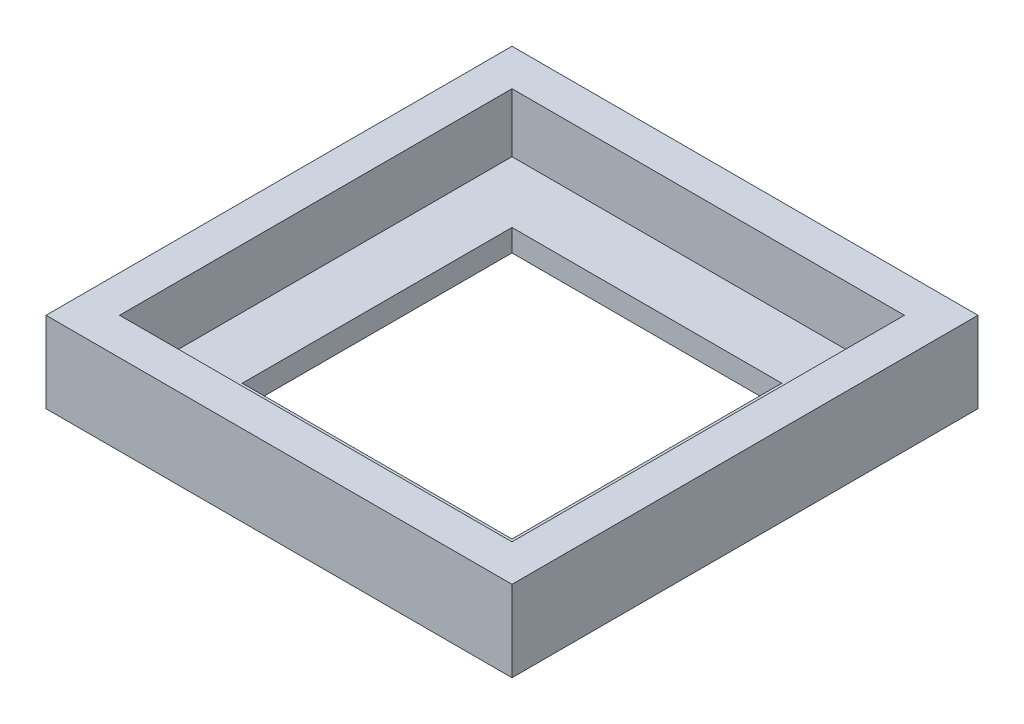
ISO-10303-21;
HEADER;
FILE_DESCRIPTION(('STEP AP214'),'2;1');
FILE_NAME('part.step','',(''),(''),'','','');
FILE_SCHEMA(('AUTOMOTIVE_DESIGN { 1 0 10303 214 1 1 1 1 }'));
ENDSEC;
DATA;
#1=APPLICATION_CONTEXT('core data for automotive mechanical design processes');
#2=APPLICATION_PROTOCOL_DEFINITION('international standard','automotive_design',2000,#1);
#3=PRODUCT_CONTEXT('',#1,'mechanical');
#4=PRODUCT('Part','Part','',(#3));
#5=PRODUCT_RELATED_PRODUCT_CATEGORY('part','',(#4));
#6=PRODUCT_DEFINITION_FORMATION('','',#4);
#7=PRODUCT_DEFINITION_CONTEXT('part definition',#1,'design');
#8=PRODUCT_DEFINITION('design','',#6,#7);
#9=PRODUCT_DEFINITION_SHAPE('','',#8);
#10=(LENGTH_UNIT() NAMED_UNIT(*) SI_UNIT(.MILLI.,.METRE.));
#11=(NAMED_UNIT(*) PLANE_ANGLE_UNIT() SI_UNIT($,.RADIAN.));
#12=(NAMED_UNIT(*) SI_UNIT($,.STERADIAN.) SOLID_ANGLE_UNIT());
#13=UNCERTAINTY_MEASURE_WITH_UNIT(LENGTH_MEASURE(1.E-05),#10,'distance_accuracy_value','');
#14=(GEOMETRIC_REPRESENTATION_CONTEXT(3) GLOBAL_UNCERTAINTY_ASSIGNED_CONTEXT((#13)) GLOBAL_UNIT_ASSIGNED_CONTEXT((#10,
#11,#12)) REPRESENTATION_CONTEXT('',''));
#15=CARTESIAN_POINT('',(0.,0.,0.));
#16=DIRECTION('',(0.,0.,1.));
#17=DIRECTION('',(1.,0.,0.));
#18=AXIS2_PLACEMENT_3D('',#15,#16,#17);
#19=CARTESIAN_POINT('',(0.,1.8,0.));
#20=DIRECTION('',(0.,1.,0.));
#21=DIRECTION('',(0.,0.,1.));
#22=AXIS2_PLACEMENT_3D('',#19,#20,#21);
#23=PLANE('',#22);
#24=DIRECTION('',(-1.,0.,0.));
#25=VECTOR('',#24,1.);
#26=CARTESIAN_POINT('',(35.,1.8,-35.));
#27=LINE('',#26,#25);
#28=CARTESIAN_POINT('',(35.,1.8,-35.));
#29=VERTEX_POINT('',#28);
#30=CARTESIAN_POINT('',(3.,1.8,-35.));
#31=VERTEX_POINT('',#30);
#32=EDGE_CURVE('E48',#29,#31,#27,.T.);
#33=ORIENTED_EDGE('',*,*,#32,.T.);
#34=DIRECTION('',(0.,0.,1.));
#35=VECTOR('',#34,1.);
#36=CARTESIAN_POINT('',(3.,1.8,-35.));
#37=LINE('',#36,#35);
#38=CARTESIAN_POINT('',(3.,1.8,-3.));
#39=VERTEX_POINT('',#38);
#40=EDGE_CURVE('E52',#31,#39,#37,.T.);
#41=ORIENTED_EDGE('',*,*,#40,.T.);
#42=DIRECTION('',(1.,0.,0.));
#43=VECTOR('',#42,1.);
#44=CARTESIAN_POINT('',(3.,1.8,-3.));
#45=LINE('',#44,#43);
#46=CARTESIAN_POINT('',(35.,1.8,-3.));
#47=VERTEX_POINT('',#46);
#48=EDGE_CURVE('E150',#39,#47,#45,.T.);
#49=ORIENTED_EDGE('',*,*,#48,.T.);
#50=DIRECTION('',(0.,0.,-1.));
#51=VECTOR('',#50,1.);
#52=CARTESIAN_POINT('',(35.,1.8,-3.));
#53=LINE('',#52,#51);
#54=EDGE_CURVE('E131',#47,#29,#53,.T.);
#55=ORIENTED_EDGE('',*,*,#54,.T.);
#56=EDGE_LOOP('',(#33,#41,#49,#55));
#57=FACE_BOUND('',#56,.T.);
#58=DIRECTION('',(1.,0.,0.));
#59=VECTOR('',#58,1.);
#60=CARTESIAN_POINT('',(8.,1.8,-8.));
#61=LINE('',#60,#59);
#62=CARTESIAN_POINT('',(8.,1.8,-8.));
#63=VERTEX_POINT('',#62);
#64=CARTESIAN_POINT('',(30.,1.8,-8.));
#65=VERTEX_POINT('',#64);
#66=EDGE_CURVE('E172',#63,#65,#61,.T.);
#67=ORIENTED_EDGE('',*,*,#66,.F.);
#68=DIRECTION('',(0.,0.,1.));
#69=VECTOR('',#68,1.);
#70=CARTESIAN_POINT('',(8.,1.8,-30.));
#71=LINE('',#70,#69);
#72=CARTESIAN_POINT('',(8.,1.8,-30.));
#73=VERTEX_POINT('',#72);
#74=EDGE_CURVE('E170',#73,#63,#71,.T.);
#75=ORIENTED_EDGE('',*,*,#74,.F.);
#76=DIRECTION('',(-1.,0.,0.));
#77=VECTOR('',#76,1.);
#78=CARTESIAN_POINT('',(30.,1.8,-30.));
#79=LINE('',#78,#77);
#80=CARTESIAN_POINT('',(30.,1.8,-30.));
#81=VERTEX_POINT('',#80);
#82=EDGE_CURVE('E178',#81,#73,#79,.T.);
#83=ORIENTED_EDGE('',*,*,#82,.F.);
#84=DIRECTION('',(0.,0.,-1.));
#85=VECTOR('',#84,1.);
#86=CARTESIAN_POINT('',(30.,1.8,-8.));
#87=LINE('',#86,#85);
#88=EDGE_CURVE('E175',#65,#81,#87,.T.);
#89=ORIENTED_EDGE('',*,*,#88,.F.);
#90=EDGE_LOOP('',(#67,#75,#83,#89));
#91=FACE_BOUND('',#90,.T.);
#92=ADVANCED_FACE('F33',(#57,#91),#23,.T.);
#93=CARTESIAN_POINT('',(0.,0.,0.));
#94=DIRECTION('',(0.,1.,0.));
#95=DIRECTION('',(0.,0.,1.));
#96=AXIS2_PLACEMENT_3D('',#93,#94,#95);
#97=PLANE('',#96);
#98=DIRECTION('',(0.,0.,1.));
#99=VECTOR('',#98,1.);
#100=CARTESIAN_POINT('',(0.,0.,-38.));
#101=LINE('',#100,#99);
#102=CARTESIAN_POINT('',(0.,0.,-38.));
#103=VERTEX_POINT('',#102);
#104=CARTESIAN_POINT('',(0.,0.,0.));
#105=VERTEX_POINT('',#104);
#106=EDGE_CURVE('E200',#103,#105,#101,.T.);
#107=ORIENTED_EDGE('',*,*,#106,.F.);
#108=DIRECTION('',(-1.,0.,0.));
#109=VECTOR('',#108,1.);
#110=CARTESIAN_POINT('',(38.,0.,-38.));
#111=LINE('',#110,#109);
#112=CARTESIAN_POINT('',(38.,0.,-38.));
#113=VERTEX_POINT('',#112);
#114=EDGE_CURVE('E207',#113,#103,#111,.T.);
#115=ORIENTED_EDGE('',*,*,#114,.F.);
#116=DIRECTION('',(0.,0.,-1.));
#117=VECTOR('',#116,1.);
#118=CARTESIAN_POINT('',(38.,0.,0.));
#119=LINE('',#118,#117);
#120=CARTESIAN_POINT('',(38.,0.,0.));
#121=VERTEX_POINT('',#120);
#122=EDGE_CURVE('E205',#121,#113,#119,.T.);
#123=ORIENTED_EDGE('',*,*,#122,.F.);
#124=DIRECTION('',(1.,0.,0.));
#125=VECTOR('',#124,1.);
#126=CARTESIAN_POINT('',(0.,0.,0.));
#127=LINE('',#126,#125);
#128=EDGE_CURVE('E203',#105,#121,#127,.T.);
#129=ORIENTED_EDGE('',*,*,#128,.F.);
#130=EDGE_LOOP('',(#107,#115,#123,#129));
#131=FACE_BOUND('',#130,.T.);
#132=DIRECTION('',(0.,0.,1.));
#133=VECTOR('',#132,1.);
#134=CARTESIAN_POINT('',(8.,0.,-30.));
#135=LINE('',#134,#133);
#136=CARTESIAN_POINT('',(8.,0.,-30.));
#137=VERTEX_POINT('',#136);
#138=CARTESIAN_POINT('',(8.,0.,-8.));
#139=VERTEX_POINT('',#138);
#140=EDGE_CURVE('E169',#137,#139,#135,.T.);
#141=ORIENTED_EDGE('',*,*,#140,.T.);
#142=DIRECTION('',(1.,0.,0.));
#143=VECTOR('',#142,1.);
#144=CARTESIAN_POINT('',(8.,0.,-8.));
#145=LINE('',#144,#143);
#146=CARTESIAN_POINT('',(30.,0.,-8.));
#147=VERTEX_POINT('',#146);
#148=EDGE_CURVE('E183',#139,#147,#145,.T.);
#149=ORIENTED_EDGE('',*,*,#148,.T.);
#150=DIRECTION('',(0.,0.,-1.));
#151=VECTOR('',#150,1.);
#152=CARTESIAN_POINT('',(30.,0.,-8.));
#153=LINE('',#152,#151);
#154=CARTESIAN_POINT('',(30.,0.,-30.));
#155=VERTEX_POINT('',#154);
#156=EDGE_CURVE('E186',#147,#155,#153,.T.);
#157=ORIENTED_EDGE('',*,*,#156,.T.);
#158=DIRECTION('',(-1.,0.,0.));
#159=VECTOR('',#158,1.);
#160=CARTESIAN_POINT('',(30.,0.,-30.));
#161=LINE('',#160,#159);
#162=EDGE_CURVE('E173',#155,#137,#161,.T.);
#163=ORIENTED_EDGE('',*,*,#162,.T.);
#164=EDGE_LOOP('',(#141,#149,#157,#163));
#165=FACE_BOUND('',#164,.T.);
#166=ADVANCED_FACE('F224',(#131,#165),#97,.F.);
#167=CARTESIAN_POINT('',(0.,1.8,-38.));
#168=DIRECTION('',(1.,0.,0.));
#169=DIRECTION('',(0.,0.,-1.));
#170=AXIS2_PLACEMENT_3D('',#167,#168,#169);
#171=PLANE('',#170);
#172=ORIENTED_EDGE('',*,*,#106,.T.);
#173=DIRECTION('',(0.,-1.,0.));
#174=VECTOR('',#173,1.);
#175=CARTESIAN_POINT('',(0.,1.8,0.));
#176=LINE('',#175,#174);
#177=CARTESIAN_POINT('',(0.,6.6,0.));
#178=VERTEX_POINT('',#177);
#179=EDGE_CURVE('E11',#178,#105,#176,.T.);
#180=ORIENTED_EDGE('',*,*,#179,.F.);
#181=DIRECTION('',(0.,0.,1.));
#182=VECTOR('',#181,1.);
#183=CARTESIAN_POINT('',(0.,6.6,-38.));
#184=LINE('',#183,#182);
#185=CARTESIAN_POINT('',(0.,6.6,-38.));
#186=VERTEX_POINT('',#185);
#187=EDGE_CURVE('E160',#186,#178,#184,.T.);
#188=ORIENTED_EDGE('',*,*,#187,.F.);
#189=DIRECTION('',(0.,-1.,0.));
#190=VECTOR('',#189,1.);
#191=CARTESIAN_POINT('',(0.,1.8,-38.));
#192=LINE('',#191,#190);
#193=EDGE_CURVE('E209',#186,#103,#192,.T.);
#194=ORIENTED_EDGE('',*,*,#193,.T.);
#195=EDGE_LOOP('',(#172,#180,#188,#194));
#196=FACE_BOUND('',#195,.T.);
#197=ADVANCED_FACE('F35',(#196),#171,.F.);
#198=CARTESIAN_POINT('',(0.,1.8,0.));
#199=DIRECTION('',(0.,0.,-1.));
#200=DIRECTION('',(-1.,0.,0.));
#201=AXIS2_PLACEMENT_3D('',#198,#199,#200);
#202=PLANE('',#201);
#203=ORIENTED_EDGE('',*,*,#128,.T.);
#204=DIRECTION('',(0.,-1.,0.));
#205=VECTOR('',#204,1.);
#206=CARTESIAN_POINT('',(38.,1.8,0.));
#207=LINE('',#206,#205);
#208=CARTESIAN_POINT('',(38.,6.6,0.));
#209=VERTEX_POINT('',#208);
#210=EDGE_CURVE('E41',#209,#121,#207,.T.);
#211=ORIENTED_EDGE('',*,*,#210,.F.);
#212=DIRECTION('',(1.,0.,0.));
#213=VECTOR('',#212,1.);
#214=CARTESIAN_POINT('',(0.,6.6,0.));
#215=LINE('',#214,#213);
#216=EDGE_CURVE('E163',#178,#209,#215,.T.);
#217=ORIENTED_EDGE('',*,*,#216,.F.);
#218=ORIENTED_EDGE('',*,*,#179,.T.);
#219=EDGE_LOOP('',(#203,#211,#217,#218));
#220=FACE_BOUND('',#219,.T.);
#221=ADVANCED_FACE('F232',(#220),#202,.F.);
#222=CARTESIAN_POINT('',(38.,1.8,0.));
#223=DIRECTION('',(-1.,0.,0.));
#224=DIRECTION('',(0.,0.,1.));
#225=AXIS2_PLACEMENT_3D('',#222,#223,#224);
#226=PLANE('',#225);
#227=ORIENTED_EDGE('',*,*,#122,.T.);
#228=DIRECTION('',(0.,-1.,0.));
#229=VECTOR('',#228,1.);
#230=CARTESIAN_POINT('',(38.,1.8,-38.));
#231=LINE('',#230,#229);
#232=CARTESIAN_POINT('',(38.,6.6,-38.));
#233=VERTEX_POINT('',#232);
#234=EDGE_CURVE('E212',#233,#113,#231,.T.);
#235=ORIENTED_EDGE('',*,*,#234,.F.);
#236=DIRECTION('',(0.,0.,-1.));
#237=VECTOR('',#236,1.);
#238=CARTESIAN_POINT('',(38.,6.6,0.));
#239=LINE('',#238,#237);
#240=EDGE_CURVE('E166',#209,#233,#239,.T.);
#241=ORIENTED_EDGE('',*,*,#240,.F.);
#242=ORIENTED_EDGE('',*,*,#210,.T.);
#243=EDGE_LOOP('',(#227,#235,#241,#242));
#244=FACE_BOUND('',#243,.T.);
#245=ADVANCED_FACE('F218',(#244),#226,.F.);
#246=CARTESIAN_POINT('',(38.,1.8,-38.));
#247=DIRECTION('',(0.,0.,1.));
#248=DIRECTION('',(1.,0.,0.));
#249=AXIS2_PLACEMENT_3D('',#246,#247,#248);
#250=PLANE('',#249);
#251=ORIENTED_EDGE('',*,*,#114,.T.);
#252=ORIENTED_EDGE('',*,*,#193,.F.);
#253=DIRECTION('',(-1.,0.,0.));
#254=VECTOR('',#253,1.);
#255=CARTESIAN_POINT('',(38.,6.6,-38.));
#256=LINE('',#255,#254);
#257=EDGE_CURVE('E136',#233,#186,#256,.T.);
#258=ORIENTED_EDGE('',*,*,#257,.F.);
#259=ORIENTED_EDGE('',*,*,#234,.T.);
#260=EDGE_LOOP('',(#251,#252,#258,#259));
#261=FACE_BOUND('',#260,.T.);
#262=ADVANCED_FACE('F227',(#261),#250,.F.);
#263=CARTESIAN_POINT('',(8.,1.8,-30.));
#264=DIRECTION('',(1.,0.,0.));
#265=DIRECTION('',(0.,0.,-1.));
#266=AXIS2_PLACEMENT_3D('',#263,#264,#265);
#267=PLANE('',#266);
#268=ORIENTED_EDGE('',*,*,#140,.F.);
#269=DIRECTION('',(0.,-1.,0.));
#270=VECTOR('',#269,1.);
#271=CARTESIAN_POINT('',(8.,1.8,-30.));
#272=LINE('',#271,#270);
#273=EDGE_CURVE('E180',#73,#137,#272,.T.);
#274=ORIENTED_EDGE('',*,*,#273,.F.);
#275=ORIENTED_EDGE('',*,*,#74,.T.);
#276=DIRECTION('',(0.,-1.,0.));
#277=VECTOR('',#276,1.);
#278=CARTESIAN_POINT('',(8.,1.8,-8.));
#279=LINE('',#278,#277);
#280=EDGE_CURVE('E197',#63,#139,#279,.T.);
#281=ORIENTED_EDGE('',*,*,#280,.T.);
#282=EDGE_LOOP('',(#268,#274,#275,#281));
#283=FACE_BOUND('',#282,.T.);
#284=ADVANCED_FACE('F247',(#283),#267,.T.);
#285=CARTESIAN_POINT('',(8.,1.8,-8.));
#286=DIRECTION('',(0.,0.,-1.));
#287=DIRECTION('',(-1.,0.,0.));
#288=AXIS2_PLACEMENT_3D('',#285,#286,#287);
#289=PLANE('',#288);
#290=ORIENTED_EDGE('',*,*,#148,.F.);
#291=ORIENTED_EDGE('',*,*,#280,.F.);
#292=ORIENTED_EDGE('',*,*,#66,.T.);
#293=DIRECTION('',(0.,-1.,0.));
#294=VECTOR('',#293,1.);
#295=CARTESIAN_POINT('',(30.,1.8,-8.));
#296=LINE('',#295,#294);
#297=EDGE_CURVE('E195',#65,#147,#296,.T.);
#298=ORIENTED_EDGE('',*,*,#297,.T.);
#299=EDGE_LOOP('',(#290,#291,#292,#298));
#300=FACE_BOUND('',#299,.T.);
#301=ADVANCED_FACE('F254',(#300),#289,.T.);
#302=CARTESIAN_POINT('',(30.,1.8,-8.));
#303=DIRECTION('',(-1.,0.,0.));
#304=DIRECTION('',(0.,0.,1.));
#305=AXIS2_PLACEMENT_3D('',#302,#303,#304);
#306=PLANE('',#305);
#307=ORIENTED_EDGE('',*,*,#156,.F.);
#308=ORIENTED_EDGE('',*,*,#297,.F.);
#309=ORIENTED_EDGE('',*,*,#88,.T.);
#310=DIRECTION('',(0.,-1.,0.));
#311=VECTOR('',#310,1.);
#312=CARTESIAN_POINT('',(30.,1.8,-30.));
#313=LINE('',#312,#311);
#314=EDGE_CURVE('E193',#81,#155,#313,.T.);
#315=ORIENTED_EDGE('',*,*,#314,.T.);
#316=EDGE_LOOP('',(#307,#308,#309,#315));
#317=FACE_BOUND('',#316,.T.);
#318=ADVANCED_FACE('F259',(#317),#306,.T.);
#319=CARTESIAN_POINT('',(30.,1.8,-30.));
#320=DIRECTION('',(0.,0.,1.));
#321=DIRECTION('',(1.,0.,0.));
#322=AXIS2_PLACEMENT_3D('',#319,#320,#321);
#323=PLANE('',#322);
#324=ORIENTED_EDGE('',*,*,#162,.F.);
#325=ORIENTED_EDGE('',*,*,#314,.F.);
#326=ORIENTED_EDGE('',*,*,#82,.T.);
#327=ORIENTED_EDGE('',*,*,#273,.T.);
#328=EDGE_LOOP('',(#324,#325,#326,#327));
#329=FACE_BOUND('',#328,.T.);
#330=ADVANCED_FACE('F266',(#329),#323,.T.);
#331=CARTESIAN_POINT('',(0.,6.6,0.));
#332=DIRECTION('',(0.,1.,0.));
#333=DIRECTION('',(0.,0.,1.));
#334=AXIS2_PLACEMENT_3D('',#331,#332,#333);
#335=PLANE('',#334);
#336=ORIENTED_EDGE('',*,*,#257,.T.);
#337=ORIENTED_EDGE('',*,*,#187,.T.);
#338=ORIENTED_EDGE('',*,*,#216,.T.);
#339=ORIENTED_EDGE('',*,*,#240,.T.);
#340=EDGE_LOOP('',(#336,#337,#338,#339));
#341=FACE_BOUND('',#340,.T.);
#342=DIRECTION('',(0.,0.,1.));
#343=VECTOR('',#342,1.);
#344=CARTESIAN_POINT('',(3.,6.6,-35.));
#345=LINE('',#344,#343);
#346=CARTESIAN_POINT('',(3.,6.6,-35.));
#347=VERTEX_POINT('',#346);
#348=CARTESIAN_POINT('',(3.,6.6,-3.));
#349=VERTEX_POINT('',#348);
#350=EDGE_CURVE('E130',#347,#349,#345,.T.);
#351=ORIENTED_EDGE('',*,*,#350,.F.);
#352=DIRECTION('',(-1.,0.,0.));
#353=VECTOR('',#352,1.);
#354=CARTESIAN_POINT('',(35.,6.6,-35.));
#355=LINE('',#354,#353);
#356=CARTESIAN_POINT('',(35.,6.6,-35.));
#357=VERTEX_POINT('',#356);
#358=EDGE_CURVE('E121',#357,#347,#355,.T.);
#359=ORIENTED_EDGE('',*,*,#358,.F.);
#360=DIRECTION('',(0.,0.,-1.));
#361=VECTOR('',#360,1.);
#362=CARTESIAN_POINT('',(35.,6.6,-3.));
#363=LINE('',#362,#361);
#364=CARTESIAN_POINT('',(35.,6.6,-3.));
#365=VERTEX_POINT('',#364);
#366=EDGE_CURVE('E144',#365,#357,#363,.T.);
#367=ORIENTED_EDGE('',*,*,#366,.F.);
#368=DIRECTION('',(1.,0.,0.));
#369=VECTOR('',#368,1.);
#370=CARTESIAN_POINT('',(3.,6.6,-3.));
#371=LINE('',#370,#369);
#372=EDGE_CURVE('E142',#349,#365,#371,.T.);
#373=ORIENTED_EDGE('',*,*,#372,.F.);
#374=EDGE_LOOP('',(#351,#359,#367,#373));
#375=FACE_BOUND('',#374,.T.);
#376=ADVANCED_FACE('F140',(#341,#375),#335,.T.);
#377=CARTESIAN_POINT('',(35.,6.6,-35.));
#378=DIRECTION('',(0.,0.,1.));
#379=DIRECTION('',(1.,0.,0.));
#380=AXIS2_PLACEMENT_3D('',#377,#378,#379);
#381=PLANE('',#380);
#382=ORIENTED_EDGE('',*,*,#32,.F.);
#383=DIRECTION('',(0.,-1.,0.));
#384=VECTOR('',#383,1.);
#385=CARTESIAN_POINT('',(35.,6.6,-35.));
#386=LINE('',#385,#384);
#387=EDGE_CURVE('E126',#357,#29,#386,.T.);
#388=ORIENTED_EDGE('',*,*,#387,.F.);
#389=ORIENTED_EDGE('',*,*,#358,.T.);
#390=DIRECTION('',(0.,-1.,0.));
#391=VECTOR('',#390,1.);
#392=CARTESIAN_POINT('',(3.,6.6,-35.));
#393=LINE('',#392,#391);
#394=EDGE_CURVE('E124',#347,#31,#393,.T.);
#395=ORIENTED_EDGE('',*,*,#394,.T.);
#396=EDGE_LOOP('',(#382,#388,#389,#395));
#397=FACE_BOUND('',#396,.T.);
#398=ADVANCED_FACE('F123',(#397),#381,.T.);
#399=CARTESIAN_POINT('',(3.,6.6,-35.));
#400=DIRECTION('',(1.,0.,0.));
#401=DIRECTION('',(0.,0.,-1.));
#402=AXIS2_PLACEMENT_3D('',#399,#400,#401);
#403=PLANE('',#402);
#404=ORIENTED_EDGE('',*,*,#40,.F.);
#405=ORIENTED_EDGE('',*,*,#394,.F.);
#406=ORIENTED_EDGE('',*,*,#350,.T.);
#407=DIRECTION('',(0.,-1.,0.));
#408=VECTOR('',#407,1.);
#409=CARTESIAN_POINT('',(3.,6.6,-3.));
#410=LINE('',#409,#408);
#411=EDGE_CURVE('E137',#349,#39,#410,.T.);
#412=ORIENTED_EDGE('',*,*,#411,.T.);
#413=EDGE_LOOP('',(#404,#405,#406,#412));
#414=FACE_BOUND('',#413,.T.);
#415=ADVANCED_FACE('F134',(#414),#403,.T.);
#416=CARTESIAN_POINT('',(3.,6.6,-3.));
#417=DIRECTION('',(0.,0.,-1.));
#418=DIRECTION('',(-1.,0.,0.));
#419=AXIS2_PLACEMENT_3D('',#416,#417,#418);
#420=PLANE('',#419);
#421=ORIENTED_EDGE('',*,*,#48,.F.);
#422=ORIENTED_EDGE('',*,*,#411,.F.);
#423=ORIENTED_EDGE('',*,*,#372,.T.);
#424=DIRECTION('',(0.,-1.,0.));
#425=VECTOR('',#424,1.);
#426=CARTESIAN_POINT('',(35.,6.6,-3.));
#427=LINE('',#426,#425);
#428=EDGE_CURVE('E154',#365,#47,#427,.T.);
#429=ORIENTED_EDGE('',*,*,#428,.T.);
#430=EDGE_LOOP('',(#421,#422,#423,#429));
#431=FACE_BOUND('',#430,.T.);
#432=ADVANCED_FACE('F286',(#431),#420,.T.);
#433=CARTESIAN_POINT('',(35.,6.6,-3.));
#434=DIRECTION('',(-1.,0.,0.));
#435=DIRECTION('',(0.,0.,1.));
#436=AXIS2_PLACEMENT_3D('',#433,#434,#435);
#437=PLANE('',#436);
#438=ORIENTED_EDGE('',*,*,#54,.F.);
#439=ORIENTED_EDGE('',*,*,#428,.F.);
#440=ORIENTED_EDGE('',*,*,#366,.T.);
#441=ORIENTED_EDGE('',*,*,#387,.T.);
#442=EDGE_LOOP('',(#438,#439,#440,#441));
#443=FACE_BOUND('',#442,.T.);
#444=ADVANCED_FACE('F289',(#443),#437,.T.);
#445=CLOSED_SHELL('',(#92,#166,#197,#221,#245,#262,#284,#301,#318,#330,#376,#398,#415,#432,#444));
#446=MANIFOLD_SOLID_BREP('B2',#445);
#447=ADVANCED_BREP_SHAPE_REPRESENTATION('',(#18,#446),#14);
#448=SHAPE_DEFINITION_REPRESENTATION(#9,#447);
ENDSEC;
END-ISO-10303-21;
